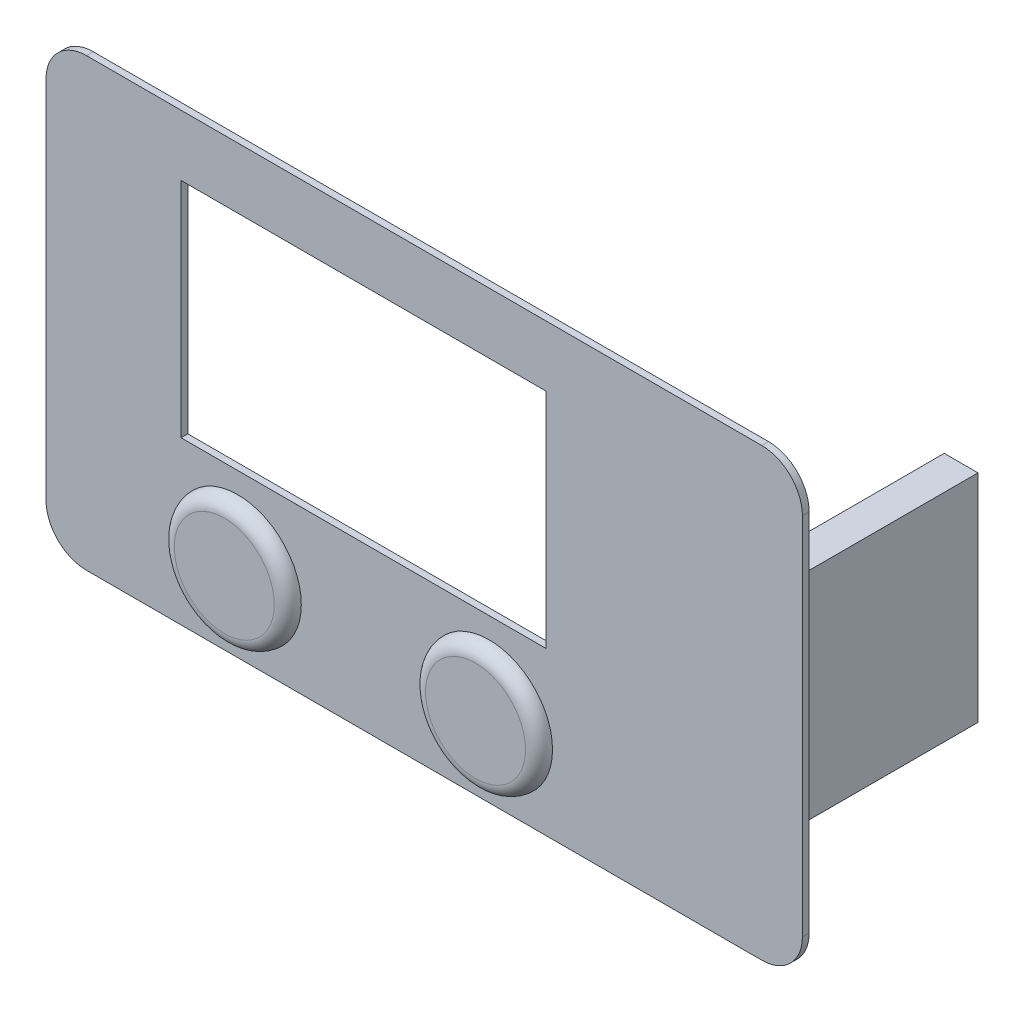
ISO-10303-21;
HEADER;
FILE_DESCRIPTION(('STEP AP214'),'2;1');
FILE_NAME('part.step','',(''),(''),'','','');
FILE_SCHEMA(('AUTOMOTIVE_DESIGN { 1 0 10303 214 1 1 1 1 }'));
ENDSEC;
DATA;
#1=APPLICATION_CONTEXT('core data for automotive mechanical design processes');
#2=APPLICATION_PROTOCOL_DEFINITION('international standard','automotive_design',2000,#1);
#3=PRODUCT_CONTEXT('',#1,'mechanical');
#4=PRODUCT('Part','Part','',(#3));
#5=PRODUCT_RELATED_PRODUCT_CATEGORY('part','',(#4));
#6=PRODUCT_DEFINITION_FORMATION('','',#4);
#7=PRODUCT_DEFINITION_CONTEXT('part definition',#1,'design');
#8=PRODUCT_DEFINITION('design','',#6,#7);
#9=PRODUCT_DEFINITION_SHAPE('','',#8);
#10=(LENGTH_UNIT() NAMED_UNIT(*) SI_UNIT(.MILLI.,.METRE.));
#11=(NAMED_UNIT(*) PLANE_ANGLE_UNIT() SI_UNIT($,.RADIAN.));
#12=(NAMED_UNIT(*) SI_UNIT($,.STERADIAN.) SOLID_ANGLE_UNIT());
#13=UNCERTAINTY_MEASURE_WITH_UNIT(LENGTH_MEASURE(1.E-05),#10,'distance_accuracy_value','');
#14=(GEOMETRIC_REPRESENTATION_CONTEXT(3) GLOBAL_UNCERTAINTY_ASSIGNED_CONTEXT((#13)) GLOBAL_UNIT_ASSIGNED_CONTEXT((#10,
#11,#12)) REPRESENTATION_CONTEXT('',''));
#15=CARTESIAN_POINT('',(0.,0.,0.));
#16=DIRECTION('',(0.,0.,1.));
#17=DIRECTION('',(1.,0.,0.));
#18=AXIS2_PLACEMENT_3D('',#15,#16,#17);
#19=CARTESIAN_POINT('',(0.,0.,0.));
#20=DIRECTION('',(0.,0.,1.));
#21=DIRECTION('',(1.,0.,0.));
#22=AXIS2_PLACEMENT_3D('',#19,#20,#21);
#23=PLANE('',#22);
#24=DIRECTION('',(0.,-1.,0.));
#25=VECTOR('',#24,1.);
#26=CARTESIAN_POINT('',(-28.,16.5,0.));
#27=LINE('',#26,#25);
#28=CARTESIAN_POINT('',(-28.,13.5,0.));
#29=VERTEX_POINT('',#28);
#30=CARTESIAN_POINT('',(-28.,-13.5,0.));
#31=VERTEX_POINT('',#30);
#32=EDGE_CURVE('E268',#29,#31,#27,.T.);
#33=ORIENTED_EDGE('',*,*,#32,.F.);
#34=CARTESIAN_POINT('',(-25.,13.5,0.));
#35=DIRECTION('',(0.,0.,1.));
#36=DIRECTION('',(1.,0.,0.));
#37=AXIS2_PLACEMENT_3D('',#34,#35,#36);
#38=CIRCLE('',#37,3.);
#39=CARTESIAN_POINT('',(-25.,16.5,0.));
#40=VERTEX_POINT('',#39);
#41=EDGE_CURVE('E297',#29,#40,#38,.F.);
#42=ORIENTED_EDGE('',*,*,#41,.T.);
#43=DIRECTION('',(-1.,0.,0.));
#44=VECTOR('',#43,1.);
#45=CARTESIAN_POINT('',(-28.,16.5,0.));
#46=LINE('',#45,#44);
#47=CARTESIAN_POINT('',(25.,16.5,0.));
#48=VERTEX_POINT('',#47);
#49=EDGE_CURVE('E264',#48,#40,#46,.T.);
#50=ORIENTED_EDGE('',*,*,#49,.F.);
#51=CARTESIAN_POINT('',(25.,13.5,0.));
#52=DIRECTION('',(0.,0.,1.));
#53=DIRECTION('',(1.,0.,0.));
#54=AXIS2_PLACEMENT_3D('',#51,#52,#53);
#55=CIRCLE('',#54,3.);
#56=CARTESIAN_POINT('',(28.,13.5,0.));
#57=VERTEX_POINT('',#56);
#58=EDGE_CURVE('E288',#48,#57,#55,.F.);
#59=ORIENTED_EDGE('',*,*,#58,.T.);
#60=DIRECTION('',(0.,1.,0.));
#61=VECTOR('',#60,1.);
#62=CARTESIAN_POINT('',(28.,16.5,0.));
#63=LINE('',#62,#61);
#64=CARTESIAN_POINT('',(28.,-13.5,0.));
#65=VERTEX_POINT('',#64);
#66=EDGE_CURVE('E244',#65,#57,#63,.T.);
#67=ORIENTED_EDGE('',*,*,#66,.F.);
#68=CARTESIAN_POINT('',(25.,-13.5,0.));
#69=DIRECTION('',(0.,0.,1.));
#70=DIRECTION('',(1.,0.,0.));
#71=AXIS2_PLACEMENT_3D('',#68,#69,#70);
#72=CIRCLE('',#71,3.);
#73=CARTESIAN_POINT('',(25.,-16.5,0.));
#74=VERTEX_POINT('',#73);
#75=EDGE_CURVE('E291',#65,#74,#72,.F.);
#76=ORIENTED_EDGE('',*,*,#75,.T.);
#77=DIRECTION('',(1.,0.,0.));
#78=VECTOR('',#77,1.);
#79=CARTESIAN_POINT('',(-28.,-16.5,0.));
#80=LINE('',#79,#78);
#81=CARTESIAN_POINT('',(-25.,-16.5,0.));
#82=VERTEX_POINT('',#81);
#83=EDGE_CURVE('E250',#82,#74,#80,.T.);
#84=ORIENTED_EDGE('',*,*,#83,.F.);
#85=CARTESIAN_POINT('',(-25.,-13.5,0.));
#86=DIRECTION('',(0.,0.,1.));
#87=DIRECTION('',(1.,0.,0.));
#88=AXIS2_PLACEMENT_3D('',#85,#86,#87);
#89=CIRCLE('',#88,3.);
#90=EDGE_CURVE('E294',#82,#31,#89,.F.);
#91=ORIENTED_EDGE('',*,*,#90,.T.);
#92=EDGE_LOOP('',(#33,#42,#50,#59,#67,#76,#84,#91));
#93=FACE_BOUND('',#92,.T.);
#94=DIRECTION('',(1.,0.,0.));
#95=VECTOR('',#94,1.);
#96=CARTESIAN_POINT('',(-18.,12.,0.));
#97=LINE('',#96,#95);
#98=CARTESIAN_POINT('',(-18.,12.,0.));
#99=VERTEX_POINT('',#98);
#100=CARTESIAN_POINT('',(9.,12.,0.));
#101=VERTEX_POINT('',#100);
#102=EDGE_CURVE('E208',#99,#101,#97,.T.);
#103=ORIENTED_EDGE('',*,*,#102,.F.);
#104=DIRECTION('',(0.,1.,0.));
#105=VECTOR('',#104,1.);
#106=CARTESIAN_POINT('',(-18.,12.,0.));
#107=LINE('',#106,#105);
#108=CARTESIAN_POINT('',(-18.,-4.5,0.));
#109=VERTEX_POINT('',#108);
#110=EDGE_CURVE('E212',#109,#99,#107,.T.);
#111=ORIENTED_EDGE('',*,*,#110,.F.);
#112=DIRECTION('',(-1.,0.,0.));
#113=VECTOR('',#112,1.);
#114=CARTESIAN_POINT('',(-18.,-4.5,0.));
#115=LINE('',#114,#113);
#116=CARTESIAN_POINT('',(9.,-4.5,0.));
#117=VERTEX_POINT('',#116);
#118=EDGE_CURVE('E215',#117,#109,#115,.T.);
#119=ORIENTED_EDGE('',*,*,#118,.F.);
#120=DIRECTION('',(0.,-1.,0.));
#121=VECTOR('',#120,1.);
#122=CARTESIAN_POINT('',(9.,12.,0.));
#123=LINE('',#122,#121);
#124=EDGE_CURVE('E204',#101,#117,#123,.T.);
#125=ORIENTED_EDGE('',*,*,#124,.F.);
#126=EDGE_LOOP('',(#103,#111,#119,#125));
#127=FACE_BOUND('',#126,.T.);
#128=DIRECTION('',(0.,-1.,0.));
#129=VECTOR('',#128,1.);
#130=CARTESIAN_POINT('',(25.5,7.25,0.));
#131=LINE('',#130,#129);
#132=CARTESIAN_POINT('',(25.5,7.25,0.));
#133=VERTEX_POINT('',#132);
#134=CARTESIAN_POINT('',(25.5,-8.75,0.));
#135=VERTEX_POINT('',#134);
#136=EDGE_CURVE('E187',#133,#135,#131,.T.);
#137=ORIENTED_EDGE('',*,*,#136,.F.);
#138=DIRECTION('',(1.,0.,0.));
#139=VECTOR('',#138,1.);
#140=CARTESIAN_POINT('',(25.5,7.25,0.));
#141=LINE('',#140,#139);
#142=CARTESIAN_POINT('',(23.,7.25,0.));
#143=VERTEX_POINT('',#142);
#144=EDGE_CURVE('E184',#143,#133,#141,.T.);
#145=ORIENTED_EDGE('',*,*,#144,.F.);
#146=DIRECTION('',(0.,1.,0.));
#147=VECTOR('',#146,1.);
#148=CARTESIAN_POINT('',(23.,7.25,0.));
#149=LINE('',#148,#147);
#150=CARTESIAN_POINT('',(23.,-8.75,0.));
#151=VERTEX_POINT('',#150);
#152=EDGE_CURVE('E455',#151,#143,#149,.T.);
#153=ORIENTED_EDGE('',*,*,#152,.F.);
#154=DIRECTION('',(-1.,0.,0.));
#155=VECTOR('',#154,1.);
#156=CARTESIAN_POINT('',(25.5,-8.75,0.));
#157=LINE('',#156,#155);
#158=EDGE_CURVE('E448',#135,#151,#157,.T.);
#159=ORIENTED_EDGE('',*,*,#158,.F.);
#160=EDGE_LOOP('',(#137,#145,#153,#159));
#161=FACE_BOUND('',#160,.T.);
#162=ADVANCED_FACE('F45',(#93,#127,#161),#23,.F.);
#163=CARTESIAN_POINT('',(28.,16.5,0.5));
#164=DIRECTION('',(-1.,0.,0.));
#165=DIRECTION('',(0.,-1.,0.));
#166=AXIS2_PLACEMENT_3D('',#163,#164,#165);
#167=PLANE('',#166);
#168=DIRECTION('',(0.,1.,0.));
#169=VECTOR('',#168,1.);
#170=CARTESIAN_POINT('',(28.,16.5,0.5));
#171=LINE('',#170,#169);
#172=CARTESIAN_POINT('',(28.,-13.5,0.5));
#173=VERTEX_POINT('',#172);
#174=CARTESIAN_POINT('',(28.,13.5,0.5));
#175=VERTEX_POINT('',#174);
#176=EDGE_CURVE('E245',#173,#175,#171,.T.);
#177=ORIENTED_EDGE('',*,*,#176,.F.);
#178=DIRECTION('',(0.,0.,-1.));
#179=VECTOR('',#178,1.);
#180=CARTESIAN_POINT('',(28.,-13.5,0.5));
#181=LINE('',#180,#179);
#182=EDGE_CURVE('E11',#173,#65,#181,.T.);
#183=ORIENTED_EDGE('',*,*,#182,.T.);
#184=ORIENTED_EDGE('',*,*,#66,.T.);
#185=DIRECTION('',(0.,0.,-1.));
#186=VECTOR('',#185,1.);
#187=CARTESIAN_POINT('',(28.,13.5,0.5));
#188=LINE('',#187,#186);
#189=EDGE_CURVE('E54',#57,#175,#188,.F.);
#190=ORIENTED_EDGE('',*,*,#189,.T.);
#191=EDGE_LOOP('',(#177,#183,#184,#190));
#192=FACE_BOUND('',#191,.T.);
#193=ADVANCED_FACE('F327',(#192),#167,.F.);
#194=CARTESIAN_POINT('',(-28.,16.5,0.5));
#195=DIRECTION('',(0.,-1.,0.));
#196=DIRECTION('',(0.,0.,-1.));
#197=AXIS2_PLACEMENT_3D('',#194,#195,#196);
#198=PLANE('',#197);
#199=ORIENTED_EDGE('',*,*,#49,.T.);
#200=DIRECTION('',(0.,0.,-1.));
#201=VECTOR('',#200,1.);
#202=CARTESIAN_POINT('',(-25.,16.5,0.5));
#203=LINE('',#202,#201);
#204=CARTESIAN_POINT('',(-25.,16.5,0.5));
#205=VERTEX_POINT('',#204);
#206=EDGE_CURVE('E304',#40,#205,#203,.F.);
#207=ORIENTED_EDGE('',*,*,#206,.T.);
#208=DIRECTION('',(-1.,0.,0.));
#209=VECTOR('',#208,1.);
#210=CARTESIAN_POINT('',(-28.,16.5,0.5));
#211=LINE('',#210,#209);
#212=CARTESIAN_POINT('',(25.,16.5,0.5));
#213=VERTEX_POINT('',#212);
#214=EDGE_CURVE('E249',#213,#205,#211,.T.);
#215=ORIENTED_EDGE('',*,*,#214,.F.);
#216=DIRECTION('',(0.,0.,-1.));
#217=VECTOR('',#216,1.);
#218=CARTESIAN_POINT('',(25.,16.5,0.5));
#219=LINE('',#218,#217);
#220=EDGE_CURVE('E300',#213,#48,#219,.T.);
#221=ORIENTED_EDGE('',*,*,#220,.T.);
#222=EDGE_LOOP('',(#199,#207,#215,#221));
#223=FACE_BOUND('',#222,.T.);
#224=ADVANCED_FACE('F338',(#223),#198,.F.);
#225=CARTESIAN_POINT('',(-28.,16.5,0.5));
#226=DIRECTION('',(1.,0.,0.));
#227=DIRECTION('',(0.,1.,0.));
#228=AXIS2_PLACEMENT_3D('',#225,#226,#227);
#229=PLANE('',#228);
#230=DIRECTION('',(0.,-1.,0.));
#231=VECTOR('',#230,1.);
#232=CARTESIAN_POINT('',(-28.,16.5,0.5));
#233=LINE('',#232,#231);
#234=CARTESIAN_POINT('',(-28.,13.5,0.5));
#235=VERTEX_POINT('',#234);
#236=CARTESIAN_POINT('',(-28.,-13.5,0.5));
#237=VERTEX_POINT('',#236);
#238=EDGE_CURVE('E254',#235,#237,#233,.T.);
#239=ORIENTED_EDGE('',*,*,#238,.F.);
#240=DIRECTION('',(0.,0.,-1.));
#241=VECTOR('',#240,1.);
#242=CARTESIAN_POINT('',(-28.,13.5,0.5));
#243=LINE('',#242,#241);
#244=EDGE_CURVE('E284',#235,#29,#243,.T.);
#245=ORIENTED_EDGE('',*,*,#244,.T.);
#246=ORIENTED_EDGE('',*,*,#32,.T.);
#247=DIRECTION('',(0.,0.,-1.));
#248=VECTOR('',#247,1.);
#249=CARTESIAN_POINT('',(-28.,-13.5,0.5));
#250=LINE('',#249,#248);
#251=EDGE_CURVE('E281',#31,#237,#250,.F.);
#252=ORIENTED_EDGE('',*,*,#251,.T.);
#253=EDGE_LOOP('',(#239,#245,#246,#252));
#254=FACE_BOUND('',#253,.T.);
#255=ADVANCED_FACE('F349',(#254),#229,.F.);
#256=CARTESIAN_POINT('',(-28.,-16.5,0.5));
#257=DIRECTION('',(0.,1.,0.));
#258=DIRECTION('',(0.,0.,1.));
#259=AXIS2_PLACEMENT_3D('',#256,#257,#258);
#260=PLANE('',#259);
#261=DIRECTION('',(1.,0.,0.));
#262=VECTOR('',#261,1.);
#263=CARTESIAN_POINT('',(-28.,-16.5,0.5));
#264=LINE('',#263,#262);
#265=CARTESIAN_POINT('',(-25.,-16.5,0.5));
#266=VERTEX_POINT('',#265);
#267=CARTESIAN_POINT('',(25.,-16.5,0.5));
#268=VERTEX_POINT('',#267);
#269=EDGE_CURVE('E257',#266,#268,#264,.T.);
#270=ORIENTED_EDGE('',*,*,#269,.F.);
#271=DIRECTION('',(0.,0.,-1.));
#272=VECTOR('',#271,1.);
#273=CARTESIAN_POINT('',(-25.,-16.5,0.5));
#274=LINE('',#273,#272);
#275=EDGE_CURVE('E320',#266,#82,#274,.T.);
#276=ORIENTED_EDGE('',*,*,#275,.T.);
#277=ORIENTED_EDGE('',*,*,#83,.T.);
#278=DIRECTION('',(0.,0.,-1.));
#279=VECTOR('',#278,1.);
#280=CARTESIAN_POINT('',(25.,-16.5,0.5));
#281=LINE('',#280,#279);
#282=EDGE_CURVE('E61',#74,#268,#281,.F.);
#283=ORIENTED_EDGE('',*,*,#282,.T.);
#284=EDGE_LOOP('',(#270,#276,#277,#283));
#285=FACE_BOUND('',#284,.T.);
#286=ADVANCED_FACE('F355',(#285),#260,.F.);
#287=CARTESIAN_POINT('',(0.,0.,0.5));
#288=DIRECTION('',(0.,0.,1.));
#289=DIRECTION('',(1.,0.,0.));
#290=AXIS2_PLACEMENT_3D('',#287,#288,#289);
#291=PLANE('',#290);
#292=CARTESIAN_POINT('',(4.8,-10.75,0.5));
#293=DIRECTION('',(0.,0.,1.));
#294=DIRECTION('',(1.,0.,0.));
#295=AXIS2_PLACEMENT_3D('',#292,#293,#294);
#296=CIRCLE('',#295,4.7);
#297=CARTESIAN_POINT('',(9.5,-10.75,0.5));
#298=VERTEX_POINT('',#297);
#299=EDGE_CURVE('E189',#298,#298,#296,.T.);
#300=ORIENTED_EDGE('',*,*,#299,.F.);
#301=EDGE_LOOP('',(#300));
#302=FACE_BOUND('',#301,.T.);
#303=CARTESIAN_POINT('',(-13.8,-10.75,0.5));
#304=DIRECTION('',(0.,0.,1.));
#305=DIRECTION('',(1.,0.,0.));
#306=AXIS2_PLACEMENT_3D('',#303,#304,#305);
#307=CIRCLE('',#306,4.7);
#308=CARTESIAN_POINT('',(-9.1,-10.75,0.5));
#309=VERTEX_POINT('',#308);
#310=EDGE_CURVE('E194',#309,#309,#307,.T.);
#311=ORIENTED_EDGE('',*,*,#310,.F.);
#312=EDGE_LOOP('',(#311));
#313=FACE_BOUND('',#312,.T.);
#314=DIRECTION('',(0.,-1.,0.));
#315=VECTOR('',#314,1.);
#316=CARTESIAN_POINT('',(-18.,12.,0.5));
#317=LINE('',#316,#315);
#318=CARTESIAN_POINT('',(-18.,12.,0.5));
#319=VERTEX_POINT('',#318);
#320=CARTESIAN_POINT('',(-18.,-4.5,0.5));
#321=VERTEX_POINT('',#320);
#322=EDGE_CURVE('E203',#319,#321,#317,.T.);
#323=ORIENTED_EDGE('',*,*,#322,.F.);
#324=DIRECTION('',(-1.,0.,0.));
#325=VECTOR('',#324,1.);
#326=CARTESIAN_POINT('',(-18.,12.,0.5));
#327=LINE('',#326,#325);
#328=CARTESIAN_POINT('',(9.,12.,0.5));
#329=VERTEX_POINT('',#328);
#330=EDGE_CURVE('E226',#329,#319,#327,.T.);
#331=ORIENTED_EDGE('',*,*,#330,.F.);
#332=DIRECTION('',(0.,1.,0.));
#333=VECTOR('',#332,1.);
#334=CARTESIAN_POINT('',(9.,12.,0.5));
#335=LINE('',#334,#333);
#336=CARTESIAN_POINT('',(9.,-4.5,0.5));
#337=VERTEX_POINT('',#336);
#338=EDGE_CURVE('E222',#337,#329,#335,.T.);
#339=ORIENTED_EDGE('',*,*,#338,.F.);
#340=DIRECTION('',(1.,0.,0.));
#341=VECTOR('',#340,1.);
#342=CARTESIAN_POINT('',(-18.,-4.5,0.5));
#343=LINE('',#342,#341);
#344=EDGE_CURVE('E218',#321,#337,#343,.T.);
#345=ORIENTED_EDGE('',*,*,#344,.F.);
#346=EDGE_LOOP('',(#323,#331,#339,#345));
#347=FACE_BOUND('',#346,.T.);
#348=ORIENTED_EDGE('',*,*,#214,.T.);
#349=CARTESIAN_POINT('',(-25.,13.5,0.5));
#350=DIRECTION('',(0.,0.,1.));
#351=DIRECTION('',(1.,0.,0.));
#352=AXIS2_PLACEMENT_3D('',#349,#350,#351);
#353=CIRCLE('',#352,3.);
#354=EDGE_CURVE('E315',#205,#235,#353,.T.);
#355=ORIENTED_EDGE('',*,*,#354,.T.);
#356=ORIENTED_EDGE('',*,*,#238,.T.);
#357=CARTESIAN_POINT('',(-25.,-13.5,0.5));
#358=DIRECTION('',(0.,0.,1.));
#359=DIRECTION('',(1.,0.,0.));
#360=AXIS2_PLACEMENT_3D('',#357,#358,#359);
#361=CIRCLE('',#360,3.);
#362=EDGE_CURVE('E68',#237,#266,#361,.T.);
#363=ORIENTED_EDGE('',*,*,#362,.T.);
#364=ORIENTED_EDGE('',*,*,#269,.T.);
#365=CARTESIAN_POINT('',(25.,-13.5,0.5));
#366=DIRECTION('',(0.,0.,1.));
#367=DIRECTION('',(1.,0.,0.));
#368=AXIS2_PLACEMENT_3D('',#365,#366,#367);
#369=CIRCLE('',#368,3.);
#370=EDGE_CURVE('E310',#268,#173,#369,.T.);
#371=ORIENTED_EDGE('',*,*,#370,.T.);
#372=ORIENTED_EDGE('',*,*,#176,.T.);
#373=CARTESIAN_POINT('',(25.,13.5,0.5));
#374=DIRECTION('',(0.,0.,1.));
#375=DIRECTION('',(1.,0.,0.));
#376=AXIS2_PLACEMENT_3D('',#373,#374,#375);
#377=CIRCLE('',#376,3.);
#378=EDGE_CURVE('E307',#175,#213,#377,.T.);
#379=ORIENTED_EDGE('',*,*,#378,.T.);
#380=EDGE_LOOP('',(#348,#355,#356,#363,#364,#371,#372,#379));
#381=FACE_BOUND('',#380,.T.);
#382=ADVANCED_FACE('F332',(#302,#313,#347,#381),#291,.T.);
#383=CARTESIAN_POINT('',(-18.,12.,-31.6425346645935));
#384=DIRECTION('',(-1.,0.,0.));
#385=DIRECTION('',(0.,-1.,0.));
#386=AXIS2_PLACEMENT_3D('',#383,#384,#385);
#387=PLANE('',#386);
#388=ORIENTED_EDGE('',*,*,#110,.T.);
#389=DIRECTION('',(0.,0.,1.));
#390=VECTOR('',#389,1.);
#391=CARTESIAN_POINT('',(-18.,12.,-31.6425346645935));
#392=LINE('',#391,#390);
#393=EDGE_CURVE('E209',#99,#319,#392,.T.);
#394=ORIENTED_EDGE('',*,*,#393,.T.);
#395=ORIENTED_EDGE('',*,*,#322,.T.);
#396=DIRECTION('',(0.,0.,1.));
#397=VECTOR('',#396,1.);
#398=CARTESIAN_POINT('',(-18.,-4.5,-31.6425346645935));
#399=LINE('',#398,#397);
#400=EDGE_CURVE('E230',#109,#321,#399,.T.);
#401=ORIENTED_EDGE('',*,*,#400,.F.);
#402=EDGE_LOOP('',(#388,#394,#395,#401));
#403=FACE_BOUND('',#402,.T.);
#404=ADVANCED_FACE('F420',(#403),#387,.F.);
#405=CARTESIAN_POINT('',(-18.,12.,-31.6425346645935));
#406=DIRECTION('',(0.,1.,0.));
#407=DIRECTION('',(0.,0.,1.));
#408=AXIS2_PLACEMENT_3D('',#405,#406,#407);
#409=PLANE('',#408);
#410=ORIENTED_EDGE('',*,*,#102,.T.);
#411=DIRECTION('',(0.,0.,1.));
#412=VECTOR('',#411,1.);
#413=CARTESIAN_POINT('',(9.,12.,-31.6425346645935));
#414=LINE('',#413,#412);
#415=EDGE_CURVE('E233',#101,#329,#414,.T.);
#416=ORIENTED_EDGE('',*,*,#415,.T.);
#417=ORIENTED_EDGE('',*,*,#330,.T.);
#418=ORIENTED_EDGE('',*,*,#393,.F.);
#419=EDGE_LOOP('',(#410,#416,#417,#418));
#420=FACE_BOUND('',#419,.T.);
#421=ADVANCED_FACE('F416',(#420),#409,.F.);
#422=CARTESIAN_POINT('',(9.,12.,-31.6425346645935));
#423=DIRECTION('',(1.,0.,0.));
#424=DIRECTION('',(0.,1.,0.));
#425=AXIS2_PLACEMENT_3D('',#422,#423,#424);
#426=PLANE('',#425);
#427=ORIENTED_EDGE('',*,*,#124,.T.);
#428=DIRECTION('',(0.,0.,1.));
#429=VECTOR('',#428,1.);
#430=CARTESIAN_POINT('',(9.,-4.5,-31.6425346645935));
#431=LINE('',#430,#429);
#432=EDGE_CURVE('E236',#117,#337,#431,.T.);
#433=ORIENTED_EDGE('',*,*,#432,.T.);
#434=ORIENTED_EDGE('',*,*,#338,.T.);
#435=ORIENTED_EDGE('',*,*,#415,.F.);
#436=EDGE_LOOP('',(#427,#433,#434,#435));
#437=FACE_BOUND('',#436,.T.);
#438=ADVANCED_FACE('F419',(#437),#426,.F.);
#439=CARTESIAN_POINT('',(-18.,-4.5,-31.6425346645935));
#440=DIRECTION('',(0.,-1.,0.));
#441=DIRECTION('',(0.,0.,-1.));
#442=AXIS2_PLACEMENT_3D('',#439,#440,#441);
#443=PLANE('',#442);
#444=ORIENTED_EDGE('',*,*,#118,.T.);
#445=ORIENTED_EDGE('',*,*,#400,.T.);
#446=ORIENTED_EDGE('',*,*,#344,.T.);
#447=ORIENTED_EDGE('',*,*,#432,.F.);
#448=EDGE_LOOP('',(#444,#445,#446,#447));
#449=FACE_BOUND('',#448,.T.);
#450=ADVANCED_FACE('F414',(#449),#443,.F.);
#451=CARTESIAN_POINT('',(-13.8,-10.75,1.5));
#452=DIRECTION('',(0.,0.,1.));
#453=DIRECTION('',(1.,0.,0.));
#454=AXIS2_PLACEMENT_3D('',#451,#452,#453);
#455=PLANE('',#454);
#456=CARTESIAN_POINT('',(-13.8,-10.75,1.5));
#457=DIRECTION('',(0.,0.,1.));
#458=DIRECTION('',(1.,0.,0.));
#459=AXIS2_PLACEMENT_3D('',#456,#457,#458);
#460=CIRCLE('',#459,3.7);
#461=CARTESIAN_POINT('',(-10.1,-10.75,1.5));
#462=VERTEX_POINT('',#461);
#463=EDGE_CURVE('E260',#462,#462,#460,.T.);
#464=ORIENTED_EDGE('',*,*,#463,.T.);
#465=EDGE_LOOP('',(#464));
#466=FACE_BOUND('',#465,.T.);
#467=ADVANCED_FACE('F410',(#466),#455,.T.);
#468=CARTESIAN_POINT('',(4.8,-10.75,1.5));
#469=DIRECTION('',(0.,0.,1.));
#470=DIRECTION('',(1.,0.,0.));
#471=AXIS2_PLACEMENT_3D('',#468,#469,#470);
#472=PLANE('',#471);
#473=CARTESIAN_POINT('',(4.8,-10.75,1.5));
#474=DIRECTION('',(0.,0.,1.));
#475=DIRECTION('',(1.,0.,0.));
#476=AXIS2_PLACEMENT_3D('',#473,#474,#475);
#477=CIRCLE('',#476,3.7);
#478=CARTESIAN_POINT('',(8.5,-10.75,1.5));
#479=VERTEX_POINT('',#478);
#480=EDGE_CURVE('E277',#479,#479,#477,.T.);
#481=ORIENTED_EDGE('',*,*,#480,.T.);
#482=EDGE_LOOP('',(#481));
#483=FACE_BOUND('',#482,.T.);
#484=ADVANCED_FACE('F383',(#483),#472,.T.);
#485=CARTESIAN_POINT('',(-13.8,-10.75,0.5));
#486=DIRECTION('',(0.,0.,1.));
#487=DIRECTION('',(1.,0.,0.));
#488=AXIS2_PLACEMENT_3D('',#485,#486,#487);
#489=TOROIDAL_SURFACE('',#488,3.7,1.);
#490=ORIENTED_EDGE('',*,*,#310,.T.);
#491=EDGE_LOOP('',(#490));
#492=FACE_BOUND('',#491,.T.);
#493=ORIENTED_EDGE('',*,*,#463,.F.);
#494=EDGE_LOOP('',(#493));
#495=FACE_BOUND('',#494,.T.);
#496=ADVANCED_FACE('F379',(#492,#495),#489,.T.);
#497=CARTESIAN_POINT('',(4.8,-10.75,0.5));
#498=DIRECTION('',(0.,0.,1.));
#499=DIRECTION('',(1.,0.,0.));
#500=AXIS2_PLACEMENT_3D('',#497,#498,#499);
#501=TOROIDAL_SURFACE('',#500,3.7,1.);
#502=ORIENTED_EDGE('',*,*,#299,.T.);
#503=EDGE_LOOP('',(#502));
#504=FACE_BOUND('',#503,.T.);
#505=ORIENTED_EDGE('',*,*,#480,.F.);
#506=EDGE_LOOP('',(#505));
#507=FACE_BOUND('',#506,.T.);
#508=ADVANCED_FACE('F382',(#504,#507),#501,.T.);
#509=CARTESIAN_POINT('',(25.5,7.25,-15.));
#510=DIRECTION('',(-1.,0.,0.));
#511=DIRECTION('',(0.,-1.,0.));
#512=AXIS2_PLACEMENT_3D('',#509,#510,#511);
#513=PLANE('',#512);
#514=ORIENTED_EDGE('',*,*,#136,.T.);
#515=DIRECTION('',(0.,0.,1.));
#516=VECTOR('',#515,1.);
#517=CARTESIAN_POINT('',(25.5,-8.75,-15.));
#518=LINE('',#517,#516);
#519=CARTESIAN_POINT('',(25.5,-8.75,-15.));
#520=VERTEX_POINT('',#519);
#521=EDGE_CURVE('E166',#520,#135,#518,.T.);
#522=ORIENTED_EDGE('',*,*,#521,.F.);
#523=DIRECTION('',(0.,-1.,0.));
#524=VECTOR('',#523,1.);
#525=CARTESIAN_POINT('',(25.5,7.25,-15.));
#526=LINE('',#525,#524);
#527=CARTESIAN_POINT('',(25.5,7.25,-15.));
#528=VERTEX_POINT('',#527);
#529=EDGE_CURVE('E174',#528,#520,#526,.T.);
#530=ORIENTED_EDGE('',*,*,#529,.F.);
#531=DIRECTION('',(0.,0.,1.));
#532=VECTOR('',#531,1.);
#533=CARTESIAN_POINT('',(25.5,7.25,-15.));
#534=LINE('',#533,#532);
#535=EDGE_CURVE('E452',#528,#133,#534,.T.);
#536=ORIENTED_EDGE('',*,*,#535,.T.);
#537=EDGE_LOOP('',(#514,#522,#530,#536));
#538=FACE_BOUND('',#537,.T.);
#539=ADVANCED_FACE('F186',(#538),#513,.F.);
#540=CARTESIAN_POINT('',(25.5,-8.75,-15.));
#541=DIRECTION('',(0.,1.,0.));
#542=DIRECTION('',(-1.,0.,0.));
#543=AXIS2_PLACEMENT_3D('',#540,#541,#542);
#544=PLANE('',#543);
#545=ORIENTED_EDGE('',*,*,#158,.T.);
#546=DIRECTION('',(0.,0.,1.));
#547=VECTOR('',#546,1.);
#548=CARTESIAN_POINT('',(23.,-8.75,-15.));
#549=LINE('',#548,#547);
#550=CARTESIAN_POINT('',(23.,-8.75,-15.));
#551=VERTEX_POINT('',#550);
#552=EDGE_CURVE('E169',#551,#151,#549,.T.);
#553=ORIENTED_EDGE('',*,*,#552,.F.);
#554=DIRECTION('',(-1.,0.,0.));
#555=VECTOR('',#554,1.);
#556=CARTESIAN_POINT('',(25.5,-8.75,-15.));
#557=LINE('',#556,#555);
#558=EDGE_CURVE('E161',#520,#551,#557,.T.);
#559=ORIENTED_EDGE('',*,*,#558,.F.);
#560=ORIENTED_EDGE('',*,*,#521,.T.);
#561=EDGE_LOOP('',(#545,#553,#559,#560));
#562=FACE_BOUND('',#561,.T.);
#563=ADVANCED_FACE('F164',(#562),#544,.F.);
#564=CARTESIAN_POINT('',(23.,7.25,-15.));
#565=DIRECTION('',(1.,0.,0.));
#566=DIRECTION('',(0.,1.,0.));
#567=AXIS2_PLACEMENT_3D('',#564,#565,#566);
#568=PLANE('',#567);
#569=ORIENTED_EDGE('',*,*,#152,.T.);
#570=DIRECTION('',(0.,0.,1.));
#571=VECTOR('',#570,1.);
#572=CARTESIAN_POINT('',(23.,7.25,-15.));
#573=LINE('',#572,#571);
#574=CARTESIAN_POINT('',(23.,7.25,-15.));
#575=VERTEX_POINT('',#574);
#576=EDGE_CURVE('E196',#575,#143,#573,.T.);
#577=ORIENTED_EDGE('',*,*,#576,.F.);
#578=DIRECTION('',(0.,1.,0.));
#579=VECTOR('',#578,1.);
#580=CARTESIAN_POINT('',(23.,7.25,-15.));
#581=LINE('',#580,#579);
#582=EDGE_CURVE('E173',#551,#575,#581,.T.);
#583=ORIENTED_EDGE('',*,*,#582,.F.);
#584=ORIENTED_EDGE('',*,*,#552,.T.);
#585=EDGE_LOOP('',(#569,#577,#583,#584));
#586=FACE_BOUND('',#585,.T.);
#587=ADVANCED_FACE('F397',(#586),#568,.F.);
#588=CARTESIAN_POINT('',(25.5,7.25,-15.));
#589=DIRECTION('',(0.,-1.,0.));
#590=DIRECTION('',(0.,0.,-1.));
#591=AXIS2_PLACEMENT_3D('',#588,#589,#590);
#592=PLANE('',#591);
#593=ORIENTED_EDGE('',*,*,#144,.T.);
#594=ORIENTED_EDGE('',*,*,#535,.F.);
#595=DIRECTION('',(1.,0.,0.));
#596=VECTOR('',#595,1.);
#597=CARTESIAN_POINT('',(25.5,7.25,-15.));
#598=LINE('',#597,#596);
#599=EDGE_CURVE('E179',#575,#528,#598,.T.);
#600=ORIENTED_EDGE('',*,*,#599,.F.);
#601=ORIENTED_EDGE('',*,*,#576,.T.);
#602=EDGE_LOOP('',(#593,#594,#600,#601));
#603=FACE_BOUND('',#602,.T.);
#604=ADVANCED_FACE('F392',(#603),#592,.F.);
#605=CARTESIAN_POINT('',(0.,0.,-15.));
#606=DIRECTION('',(0.,0.,-1.));
#607=DIRECTION('',(-1.,0.,0.));
#608=AXIS2_PLACEMENT_3D('',#605,#606,#607);
#609=PLANE('',#608);
#610=ORIENTED_EDGE('',*,*,#529,.T.);
#611=ORIENTED_EDGE('',*,*,#558,.T.);
#612=ORIENTED_EDGE('',*,*,#582,.T.);
#613=ORIENTED_EDGE('',*,*,#599,.T.);
#614=EDGE_LOOP('',(#610,#611,#612,#613));
#615=FACE_BOUND('',#614,.T.);
#616=ADVANCED_FACE('F177',(#615),#609,.T.);
#617=CARTESIAN_POINT('',(-25.,13.5,0.5));
#618=DIRECTION('',(0.,0.,-1.));
#619=DIRECTION('',(-1.,0.,0.));
#620=AXIS2_PLACEMENT_3D('',#617,#618,#619);
#621=CYLINDRICAL_SURFACE('',#620,3.);
#622=ORIENTED_EDGE('',*,*,#354,.F.);
#623=ORIENTED_EDGE('',*,*,#206,.F.);
#624=ORIENTED_EDGE('',*,*,#41,.F.);
#625=ORIENTED_EDGE('',*,*,#244,.F.);
#626=EDGE_LOOP('',(#622,#623,#624,#625));
#627=FACE_BOUND('',#626,.T.);
#628=ADVANCED_FACE('F346',(#627),#621,.T.);
#629=CARTESIAN_POINT('',(-25.,-13.5,0.5));
#630=DIRECTION('',(0.,0.,-1.));
#631=DIRECTION('',(-1.,0.,0.));
#632=AXIS2_PLACEMENT_3D('',#629,#630,#631);
#633=CYLINDRICAL_SURFACE('',#632,3.);
#634=ORIENTED_EDGE('',*,*,#362,.F.);
#635=ORIENTED_EDGE('',*,*,#251,.F.);
#636=ORIENTED_EDGE('',*,*,#90,.F.);
#637=ORIENTED_EDGE('',*,*,#275,.F.);
#638=EDGE_LOOP('',(#634,#635,#636,#637));
#639=FACE_BOUND('',#638,.T.);
#640=ADVANCED_FACE('F353',(#639),#633,.T.);
#641=CARTESIAN_POINT('',(25.,-13.5,0.5));
#642=DIRECTION('',(0.,0.,-1.));
#643=DIRECTION('',(-1.,0.,0.));
#644=AXIS2_PLACEMENT_3D('',#641,#642,#643);
#645=CYLINDRICAL_SURFACE('',#644,3.);
#646=ORIENTED_EDGE('',*,*,#370,.F.);
#647=ORIENTED_EDGE('',*,*,#282,.F.);
#648=ORIENTED_EDGE('',*,*,#75,.F.);
#649=ORIENTED_EDGE('',*,*,#182,.F.);
#650=EDGE_LOOP('',(#646,#647,#648,#649));
#651=FACE_BOUND('',#650,.T.);
#652=ADVANCED_FACE('F357',(#651),#645,.T.);
#653=CARTESIAN_POINT('',(25.,13.5,0.5));
#654=DIRECTION('',(0.,0.,-1.));
#655=DIRECTION('',(-1.,0.,0.));
#656=AXIS2_PLACEMENT_3D('',#653,#654,#655);
#657=CYLINDRICAL_SURFACE('',#656,3.);
#658=ORIENTED_EDGE('',*,*,#378,.F.);
#659=ORIENTED_EDGE('',*,*,#189,.F.);
#660=ORIENTED_EDGE('',*,*,#58,.F.);
#661=ORIENTED_EDGE('',*,*,#220,.F.);
#662=EDGE_LOOP('',(#658,#659,#660,#661));
#663=FACE_BOUND('',#662,.T.);
#664=ADVANCED_FACE('F47',(#663),#657,.T.);
#665=CLOSED_SHELL('',(#162,#193,#224,#255,#286,#382,#404,#421,#438,#450,#467,#484,#496,#508,
#539,#563,#587,#604,#616,#628,#640,#652,#664));
#666=MANIFOLD_SOLID_BREP('B2',#665);
#667=ADVANCED_BREP_SHAPE_REPRESENTATION('',(#18,#666),#14);
#668=SHAPE_DEFINITION_REPRESENTATION(#9,#667);
ENDSEC;
END-ISO-10303-21;
